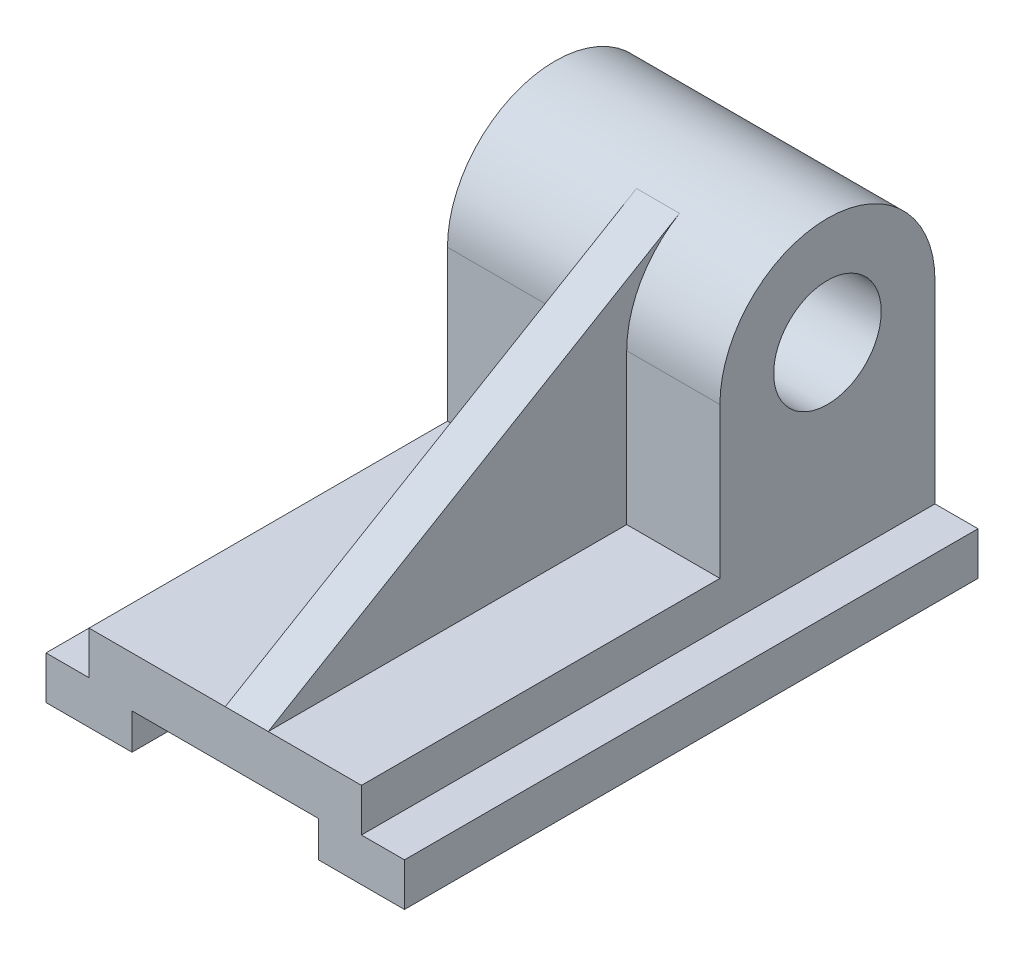
ISO-10303-21;
HEADER;
FILE_DESCRIPTION(('STEP AP214'),'2;1');
FILE_NAME('part.step','',(''),(''),'','','');
FILE_SCHEMA(('AUTOMOTIVE_DESIGN { 1 0 10303 214 1 1 1 1 }'));
ENDSEC;
DATA;
#1=APPLICATION_CONTEXT('core data for automotive mechanical design processes');
#2=APPLICATION_PROTOCOL_DEFINITION('international standard','automotive_design',2000,#1);
#3=PRODUCT_CONTEXT('',#1,'mechanical');
#4=PRODUCT('Part','Part','',(#3));
#5=PRODUCT_RELATED_PRODUCT_CATEGORY('part','',(#4));
#6=PRODUCT_DEFINITION_FORMATION('','',#4);
#7=PRODUCT_DEFINITION_CONTEXT('part definition',#1,'design');
#8=PRODUCT_DEFINITION('design','',#6,#7);
#9=PRODUCT_DEFINITION_SHAPE('','',#8);
#10=(LENGTH_UNIT() NAMED_UNIT(*) SI_UNIT(.MILLI.,.METRE.));
#11=(NAMED_UNIT(*) PLANE_ANGLE_UNIT() SI_UNIT($,.RADIAN.));
#12=(NAMED_UNIT(*) SI_UNIT($,.STERADIAN.) SOLID_ANGLE_UNIT());
#13=UNCERTAINTY_MEASURE_WITH_UNIT(LENGTH_MEASURE(1.E-05),#10,'distance_accuracy_value','');
#14=(GEOMETRIC_REPRESENTATION_CONTEXT(3) GLOBAL_UNCERTAINTY_ASSIGNED_CONTEXT((#13)) GLOBAL_UNIT_ASSIGNED_CONTEXT((#10,
#11,#12)) REPRESENTATION_CONTEXT('',''));
#15=CARTESIAN_POINT('',(0.,0.,0.));
#16=DIRECTION('',(0.,0.,1.));
#17=DIRECTION('',(1.,0.,0.));
#18=AXIS2_PLACEMENT_3D('',#15,#16,#17);
#19=CARTESIAN_POINT('',(12.,24.,-160.));
#20=DIRECTION('',(0.,1.,0.));
#21=DIRECTION('',(-1.,0.,0.));
#22=AXIS2_PLACEMENT_3D('',#19,#20,#21);
#23=PLANE('',#22);
#24=DIRECTION('',(-1.,0.,0.));
#25=VECTOR('',#24,1.);
#26=CARTESIAN_POINT('',(12.,24.,0.));
#27=LINE('',#26,#25);
#28=CARTESIAN_POINT('',(50.,24.,0.));
#29=VERTEX_POINT('',#28);
#30=CARTESIAN_POINT('',(12.,24.,0.));
#31=VERTEX_POINT('',#30);
#32=EDGE_CURVE('E173',#29,#31,#27,.T.);
#33=ORIENTED_EDGE('',*,*,#32,.F.);
#34=DIRECTION('',(0.,0.,-1.));
#35=VECTOR('',#34,1.);
#36=CARTESIAN_POINT('',(50.,24.,-160.));
#37=LINE('',#36,#35);
#38=CARTESIAN_POINT('',(50.,24.,-100.));
#39=VERTEX_POINT('',#38);
#40=EDGE_CURVE('E157',#29,#39,#37,.T.);
#41=ORIENTED_EDGE('',*,*,#40,.T.);
#42=DIRECTION('',(1.,0.,0.));
#43=VECTOR('',#42,1.);
#44=CARTESIAN_POINT('',(12.,24.,-100.));
#45=LINE('',#44,#43);
#46=CARTESIAN_POINT('',(12.,24.,-100.));
#47=VERTEX_POINT('',#46);
#48=EDGE_CURVE('E56',#47,#39,#45,.T.);
#49=ORIENTED_EDGE('',*,*,#48,.F.);
#50=DIRECTION('',(0.,0.,1.));
#51=VECTOR('',#50,1.);
#52=CARTESIAN_POINT('',(12.,24.,-160.));
#53=LINE('',#52,#51);
#54=EDGE_CURVE('E174',#47,#31,#53,.T.);
#55=ORIENTED_EDGE('',*,*,#54,.T.);
#56=EDGE_LOOP('',(#33,#41,#49,#55));
#57=FACE_BOUND('',#56,.T.);
#58=ADVANCED_FACE('F33',(#57),#23,.T.);
#59=CARTESIAN_POINT('',(12.,24.,-100.));
#60=DIRECTION('',(0.,0.,1.));
#61=DIRECTION('',(0.,-1.,0.));
#62=AXIS2_PLACEMENT_3D('',#59,#60,#61);
#63=PLANE('',#62);
#64=ORIENTED_EDGE('',*,*,#48,.T.);
#65=DIRECTION('',(0.,1.,0.));
#66=VECTOR('',#65,1.);
#67=CARTESIAN_POINT('',(50.,24.,-100.));
#68=LINE('',#67,#66);
#69=CARTESIAN_POINT('',(50.,66.,-100.));
#70=VERTEX_POINT('',#69);
#71=EDGE_CURVE('E160',#39,#70,#68,.T.);
#72=ORIENTED_EDGE('',*,*,#71,.T.);
#73=DIRECTION('',(1.,0.,0.));
#74=VECTOR('',#73,1.);
#75=CARTESIAN_POINT('',(12.,66.,-100.));
#76=LINE('',#75,#74);
#77=CARTESIAN_POINT('',(12.,66.,-100.));
#78=VERTEX_POINT('',#77);
#79=EDGE_CURVE('E213',#78,#70,#76,.T.);
#80=ORIENTED_EDGE('',*,*,#79,.F.);
#81=DIRECTION('',(0.,-1.,0.));
#82=VECTOR('',#81,1.);
#83=CARTESIAN_POINT('',(12.,24.,-100.));
#84=LINE('',#83,#82);
#85=EDGE_CURVE('E201',#78,#47,#84,.T.);
#86=ORIENTED_EDGE('',*,*,#85,.T.);
#87=EDGE_LOOP('',(#64,#72,#80,#86));
#88=FACE_BOUND('',#87,.T.);
#89=ADVANCED_FACE('F362',(#88),#63,.T.);
#90=CARTESIAN_POINT('',(24.,0.,-160.));
#91=DIRECTION('',(0.,-1.,0.));
#92=DIRECTION('',(1.,0.,0.));
#93=AXIS2_PLACEMENT_3D('',#90,#91,#92);
#94=PLANE('',#93);
#95=DIRECTION('',(1.,0.,0.));
#96=VECTOR('',#95,1.);
#97=CARTESIAN_POINT('',(24.,0.,0.));
#98=LINE('',#97,#96);
#99=CARTESIAN_POINT('',(0.,0.,0.));
#100=VERTEX_POINT('',#99);
#101=CARTESIAN_POINT('',(24.,0.,0.));
#102=VERTEX_POINT('',#101);
#103=EDGE_CURVE('E211',#100,#102,#98,.T.);
#104=ORIENTED_EDGE('',*,*,#103,.F.);
#105=DIRECTION('',(0.,0.,1.));
#106=VECTOR('',#105,1.);
#107=CARTESIAN_POINT('',(0.,0.,-160.));
#108=LINE('',#107,#106);
#109=CARTESIAN_POINT('',(0.,0.,-160.));
#110=VERTEX_POINT('',#109);
#111=EDGE_CURVE('E41',#110,#100,#108,.T.);
#112=ORIENTED_EDGE('',*,*,#111,.F.);
#113=DIRECTION('',(1.,0.,0.));
#114=VECTOR('',#113,1.);
#115=CARTESIAN_POINT('',(24.,0.,-160.));
#116=LINE('',#115,#114);
#117=CARTESIAN_POINT('',(24.,0.,-160.));
#118=VERTEX_POINT('',#117);
#119=EDGE_CURVE('E218',#110,#118,#116,.T.);
#120=ORIENTED_EDGE('',*,*,#119,.T.);
#121=DIRECTION('',(0.,0.,1.));
#122=VECTOR('',#121,1.);
#123=CARTESIAN_POINT('',(24.,0.,-160.));
#124=LINE('',#123,#122);
#125=EDGE_CURVE('E251',#118,#102,#124,.T.);
#126=ORIENTED_EDGE('',*,*,#125,.T.);
#127=EDGE_LOOP('',(#104,#112,#120,#126));
#128=FACE_BOUND('',#127,.T.);
#129=ADVANCED_FACE('F35',(#128),#94,.T.);
#130=CARTESIAN_POINT('',(0.,0.,-160.));
#131=DIRECTION('',(-1.,0.,0.));
#132=DIRECTION('',(0.,0.,1.));
#133=AXIS2_PLACEMENT_3D('',#130,#131,#132);
#134=PLANE('',#133);
#135=DIRECTION('',(0.,-1.,0.));
#136=VECTOR('',#135,1.);
#137=CARTESIAN_POINT('',(0.,0.,0.));
#138=LINE('',#137,#136);
#139=CARTESIAN_POINT('',(0.,12.,0.));
#140=VERTEX_POINT('',#139);
#141=EDGE_CURVE('E222',#140,#100,#138,.T.);
#142=ORIENTED_EDGE('',*,*,#141,.F.);
#143=DIRECTION('',(0.,0.,1.));
#144=VECTOR('',#143,1.);
#145=CARTESIAN_POINT('',(0.,12.,-160.));
#146=LINE('',#145,#144);
#147=CARTESIAN_POINT('',(0.,12.,-160.));
#148=VERTEX_POINT('',#147);
#149=EDGE_CURVE('E280',#148,#140,#146,.T.);
#150=ORIENTED_EDGE('',*,*,#149,.F.);
#151=DIRECTION('',(0.,-1.,0.));
#152=VECTOR('',#151,1.);
#153=CARTESIAN_POINT('',(0.,0.,-160.));
#154=LINE('',#153,#152);
#155=EDGE_CURVE('E248',#148,#110,#154,.T.);
#156=ORIENTED_EDGE('',*,*,#155,.T.);
#157=ORIENTED_EDGE('',*,*,#111,.T.);
#158=EDGE_LOOP('',(#142,#150,#156,#157));
#159=FACE_BOUND('',#158,.T.);
#160=ADVANCED_FACE('F310',(#159),#134,.T.);
#161=CARTESIAN_POINT('',(0.,12.,-160.));
#162=DIRECTION('',(0.,1.,0.));
#163=DIRECTION('',(0.,0.,1.));
#164=AXIS2_PLACEMENT_3D('',#161,#162,#163);
#165=PLANE('',#164);
#166=DIRECTION('',(-1.,0.,0.));
#167=VECTOR('',#166,1.);
#168=CARTESIAN_POINT('',(0.,12.,0.));
#169=LINE('',#168,#167);
#170=CARTESIAN_POINT('',(12.,12.,0.));
#171=VERTEX_POINT('',#170);
#172=EDGE_CURVE('E274',#171,#140,#169,.T.);
#173=ORIENTED_EDGE('',*,*,#172,.F.);
#174=DIRECTION('',(0.,0.,1.));
#175=VECTOR('',#174,1.);
#176=CARTESIAN_POINT('',(12.,12.,-160.));
#177=LINE('',#176,#175);
#178=CARTESIAN_POINT('',(12.,12.,-160.));
#179=VERTEX_POINT('',#178);
#180=EDGE_CURVE('E282',#179,#171,#177,.T.);
#181=ORIENTED_EDGE('',*,*,#180,.F.);
#182=DIRECTION('',(-1.,0.,0.));
#183=VECTOR('',#182,1.);
#184=CARTESIAN_POINT('',(0.,12.,-160.));
#185=LINE('',#184,#183);
#186=EDGE_CURVE('E245',#179,#148,#185,.T.);
#187=ORIENTED_EDGE('',*,*,#186,.T.);
#188=ORIENTED_EDGE('',*,*,#149,.T.);
#189=EDGE_LOOP('',(#173,#181,#187,#188));
#190=FACE_BOUND('',#189,.T.);
#191=ADVANCED_FACE('F369',(#190),#165,.T.);
#192=CARTESIAN_POINT('',(12.,12.,-160.));
#193=DIRECTION('',(-1.,0.,0.));
#194=DIRECTION('',(0.,0.,1.));
#195=AXIS2_PLACEMENT_3D('',#192,#193,#194);
#196=PLANE('',#195);
#197=DIRECTION('',(0.,-1.,0.));
#198=VECTOR('',#197,1.);
#199=CARTESIAN_POINT('',(12.,12.,0.));
#200=LINE('',#199,#198);
#201=EDGE_CURVE('E272',#31,#171,#200,.T.);
#202=ORIENTED_EDGE('',*,*,#201,.F.);
#203=ORIENTED_EDGE('',*,*,#54,.F.);
#204=ORIENTED_EDGE('',*,*,#85,.F.);
#205=CARTESIAN_POINT('',(12.,66.,-130.));
#206=DIRECTION('',(1.,0.,0.));
#207=DIRECTION('',(0.,0.,1.));
#208=AXIS2_PLACEMENT_3D('',#205,#206,#207);
#209=CIRCLE('',#208,30.);
#210=CARTESIAN_POINT('',(12.,66.,-160.));
#211=VERTEX_POINT('',#210);
#212=EDGE_CURVE('E198',#211,#78,#209,.T.);
#213=ORIENTED_EDGE('',*,*,#212,.F.);
#214=DIRECTION('',(0.,-1.,0.));
#215=VECTOR('',#214,1.);
#216=CARTESIAN_POINT('',(12.,12.,-160.));
#217=LINE('',#216,#215);
#218=EDGE_CURVE('E242',#211,#179,#217,.T.);
#219=ORIENTED_EDGE('',*,*,#218,.T.);
#220=ORIENTED_EDGE('',*,*,#180,.T.);
#221=EDGE_LOOP('',(#202,#203,#204,#213,#219,#220));
#222=FACE_BOUND('',#221,.T.);
#223=CARTESIAN_POINT('',(12.,66.,-130.));
#224=DIRECTION('',(1.,0.,0.));
#225=DIRECTION('',(0.,0.,-1.));
#226=AXIS2_PLACEMENT_3D('',#223,#224,#225);
#227=CIRCLE('',#226,15.);
#228=CARTESIAN_POINT('',(12.,66.,-145.));
#229=VERTEX_POINT('',#228);
#230=EDGE_CURVE('E189',#229,#229,#227,.T.);
#231=ORIENTED_EDGE('',*,*,#230,.T.);
#232=EDGE_LOOP('',(#231));
#233=FACE_BOUND('',#232,.T.);
#234=ADVANCED_FACE('F366',(#222,#233),#196,.T.);
#235=DIRECTION('',(0.,0.,-1.));
#236=VECTOR('',#235,1.);
#237=CARTESIAN_POINT('',(62.,24.,-160.));
#238=LINE('',#237,#236);
#239=CARTESIAN_POINT('',(62.,24.,0.));
#240=VERTEX_POINT('',#239);
#241=CARTESIAN_POINT('',(62.,24.,-100.));
#242=VERTEX_POINT('',#241);
#243=EDGE_CURVE('E186',#240,#242,#238,.T.);
#244=ORIENTED_EDGE('',*,*,#243,.F.);
#245=CARTESIAN_POINT('',(88.,24.,0.));
#246=VERTEX_POINT('',#245);
#247=EDGE_CURVE('E178',#246,#240,#27,.T.);
#248=ORIENTED_EDGE('',*,*,#247,.F.);
#249=DIRECTION('',(0.,0.,1.));
#250=VECTOR('',#249,1.);
#251=CARTESIAN_POINT('',(88.,24.,-160.));
#252=LINE('',#251,#250);
#253=CARTESIAN_POINT('',(88.,24.,-100.));
#254=VERTEX_POINT('',#253);
#255=EDGE_CURVE('E285',#254,#246,#252,.T.);
#256=ORIENTED_EDGE('',*,*,#255,.F.);
#257=EDGE_CURVE('E212',#242,#254,#45,.T.);
#258=ORIENTED_EDGE('',*,*,#257,.F.);
#259=EDGE_LOOP('',(#244,#248,#256,#258));
#260=FACE_BOUND('',#259,.T.);
#261=ADVANCED_FACE('F345',(#260),#23,.T.);
#262=CARTESIAN_POINT('',(88.,24.,-160.));
#263=DIRECTION('',(1.,0.,0.));
#264=DIRECTION('',(0.,0.,-1.));
#265=AXIS2_PLACEMENT_3D('',#262,#263,#264);
#266=PLANE('',#265);
#267=DIRECTION('',(0.,1.,0.));
#268=VECTOR('',#267,1.);
#269=CARTESIAN_POINT('',(88.,24.,0.));
#270=LINE('',#269,#268);
#271=CARTESIAN_POINT('',(88.,12.,0.));
#272=VERTEX_POINT('',#271);
#273=EDGE_CURVE('E179',#272,#246,#270,.T.);
#274=ORIENTED_EDGE('',*,*,#273,.F.);
#275=DIRECTION('',(0.,0.,1.));
#276=VECTOR('',#275,1.);
#277=CARTESIAN_POINT('',(88.,12.,-160.));
#278=LINE('',#277,#276);
#279=CARTESIAN_POINT('',(88.,12.,-160.));
#280=VERTEX_POINT('',#279);
#281=EDGE_CURVE('E287',#280,#272,#278,.T.);
#282=ORIENTED_EDGE('',*,*,#281,.F.);
#283=DIRECTION('',(0.,1.,0.));
#284=VECTOR('',#283,1.);
#285=CARTESIAN_POINT('',(88.,24.,-160.));
#286=LINE('',#285,#284);
#287=CARTESIAN_POINT('',(88.,66.,-160.));
#288=VERTEX_POINT('',#287);
#289=EDGE_CURVE('E239',#280,#288,#286,.T.);
#290=ORIENTED_EDGE('',*,*,#289,.T.);
#291=CARTESIAN_POINT('',(88.,66.,-130.));
#292=DIRECTION('',(1.,0.,0.));
#293=DIRECTION('',(0.,0.,1.));
#294=AXIS2_PLACEMENT_3D('',#291,#292,#293);
#295=CIRCLE('',#294,30.);
#296=CARTESIAN_POINT('',(88.,66.,-100.));
#297=VERTEX_POINT('',#296);
#298=EDGE_CURVE('E196',#288,#297,#295,.T.);
#299=ORIENTED_EDGE('',*,*,#298,.T.);
#300=DIRECTION('',(0.,-1.,0.));
#301=VECTOR('',#300,1.);
#302=CARTESIAN_POINT('',(88.,24.,-100.));
#303=LINE('',#302,#301);
#304=EDGE_CURVE('E202',#297,#254,#303,.T.);
#305=ORIENTED_EDGE('',*,*,#304,.T.);
#306=ORIENTED_EDGE('',*,*,#255,.T.);
#307=EDGE_LOOP('',(#274,#282,#290,#299,#305,#306));
#308=FACE_BOUND('',#307,.T.);
#309=CARTESIAN_POINT('',(88.,66.,-130.));
#310=DIRECTION('',(1.,0.,0.));
#311=DIRECTION('',(0.,0.,-1.));
#312=AXIS2_PLACEMENT_3D('',#309,#310,#311);
#313=CIRCLE('',#312,15.);
#314=CARTESIAN_POINT('',(88.,66.,-145.));
#315=VERTEX_POINT('',#314);
#316=EDGE_CURVE('E185',#315,#315,#313,.T.);
#317=ORIENTED_EDGE('',*,*,#316,.F.);
#318=EDGE_LOOP('',(#317));
#319=FACE_BOUND('',#318,.T.);
#320=ADVANCED_FACE('F337',(#308,#319),#266,.T.);
#321=CARTESIAN_POINT('',(88.,12.,-160.));
#322=DIRECTION('',(0.,1.,0.));
#323=DIRECTION('',(0.,0.,1.));
#324=AXIS2_PLACEMENT_3D('',#321,#322,#323);
#325=PLANE('',#324);
#326=DIRECTION('',(-1.,0.,0.));
#327=VECTOR('',#326,1.);
#328=CARTESIAN_POINT('',(88.,12.,0.));
#329=LINE('',#328,#327);
#330=CARTESIAN_POINT('',(100.,12.,0.));
#331=VERTEX_POINT('',#330);
#332=EDGE_CURVE('E268',#331,#272,#329,.T.);
#333=ORIENTED_EDGE('',*,*,#332,.F.);
#334=DIRECTION('',(0.,0.,1.));
#335=VECTOR('',#334,1.);
#336=CARTESIAN_POINT('',(100.,12.,-160.));
#337=LINE('',#336,#335);
#338=CARTESIAN_POINT('',(100.,12.,-160.));
#339=VERTEX_POINT('',#338);
#340=EDGE_CURVE('E289',#339,#331,#337,.T.);
#341=ORIENTED_EDGE('',*,*,#340,.F.);
#342=DIRECTION('',(-1.,0.,0.));
#343=VECTOR('',#342,1.);
#344=CARTESIAN_POINT('',(88.,12.,-160.));
#345=LINE('',#344,#343);
#346=EDGE_CURVE('E236',#339,#280,#345,.T.);
#347=ORIENTED_EDGE('',*,*,#346,.T.);
#348=ORIENTED_EDGE('',*,*,#281,.T.);
#349=EDGE_LOOP('',(#333,#341,#347,#348));
#350=FACE_BOUND('',#349,.T.);
#351=ADVANCED_FACE('F334',(#350),#325,.T.);
#352=CARTESIAN_POINT('',(100.,12.,-160.));
#353=DIRECTION('',(1.,0.,0.));
#354=DIRECTION('',(0.,0.,-1.));
#355=AXIS2_PLACEMENT_3D('',#352,#353,#354);
#356=PLANE('',#355);
#357=DIRECTION('',(0.,1.,0.));
#358=VECTOR('',#357,1.);
#359=CARTESIAN_POINT('',(100.,12.,0.));
#360=LINE('',#359,#358);
#361=CARTESIAN_POINT('',(100.,0.,0.));
#362=VERTEX_POINT('',#361);
#363=EDGE_CURVE('E265',#362,#331,#360,.T.);
#364=ORIENTED_EDGE('',*,*,#363,.F.);
#365=DIRECTION('',(0.,0.,1.));
#366=VECTOR('',#365,1.);
#367=CARTESIAN_POINT('',(100.,0.,-160.));
#368=LINE('',#367,#366);
#369=CARTESIAN_POINT('',(100.,0.,-160.));
#370=VERTEX_POINT('',#369);
#371=EDGE_CURVE('E291',#370,#362,#368,.T.);
#372=ORIENTED_EDGE('',*,*,#371,.F.);
#373=DIRECTION('',(0.,1.,0.));
#374=VECTOR('',#373,1.);
#375=CARTESIAN_POINT('',(100.,12.,-160.));
#376=LINE('',#375,#374);
#377=EDGE_CURVE('E233',#370,#339,#376,.T.);
#378=ORIENTED_EDGE('',*,*,#377,.T.);
#379=ORIENTED_EDGE('',*,*,#340,.T.);
#380=EDGE_LOOP('',(#364,#372,#378,#379));
#381=FACE_BOUND('',#380,.T.);
#382=ADVANCED_FACE('F330',(#381),#356,.T.);
#383=CARTESIAN_POINT('',(100.,0.,-160.));
#384=DIRECTION('',(0.,-1.,0.));
#385=DIRECTION('',(1.,0.,0.));
#386=AXIS2_PLACEMENT_3D('',#383,#384,#385);
#387=PLANE('',#386);
#388=DIRECTION('',(1.,0.,0.));
#389=VECTOR('',#388,1.);
#390=CARTESIAN_POINT('',(100.,0.,0.));
#391=LINE('',#390,#389);
#392=CARTESIAN_POINT('',(76.,0.,0.));
#393=VERTEX_POINT('',#392);
#394=EDGE_CURVE('E262',#393,#362,#391,.T.);
#395=ORIENTED_EDGE('',*,*,#394,.F.);
#396=DIRECTION('',(0.,0.,1.));
#397=VECTOR('',#396,1.);
#398=CARTESIAN_POINT('',(76.,0.,-160.));
#399=LINE('',#398,#397);
#400=CARTESIAN_POINT('',(76.,0.,-160.));
#401=VERTEX_POINT('',#400);
#402=EDGE_CURVE('E293',#401,#393,#399,.T.);
#403=ORIENTED_EDGE('',*,*,#402,.F.);
#404=DIRECTION('',(1.,0.,0.));
#405=VECTOR('',#404,1.);
#406=CARTESIAN_POINT('',(100.,0.,-160.));
#407=LINE('',#406,#405);
#408=EDGE_CURVE('E230',#401,#370,#407,.T.);
#409=ORIENTED_EDGE('',*,*,#408,.T.);
#410=ORIENTED_EDGE('',*,*,#371,.T.);
#411=EDGE_LOOP('',(#395,#403,#409,#410));
#412=FACE_BOUND('',#411,.T.);
#413=ADVANCED_FACE('F327',(#412),#387,.T.);
#414=CARTESIAN_POINT('',(76.,0.,-160.));
#415=DIRECTION('',(-1.,0.,0.));
#416=DIRECTION('',(0.,0.,1.));
#417=AXIS2_PLACEMENT_3D('',#414,#415,#416);
#418=PLANE('',#417);
#419=DIRECTION('',(0.,-1.,0.));
#420=VECTOR('',#419,1.);
#421=CARTESIAN_POINT('',(76.,0.,0.));
#422=LINE('',#421,#420);
#423=CARTESIAN_POINT('',(76.,9.99999999999999,0.));
#424=VERTEX_POINT('',#423);
#425=EDGE_CURVE('E259',#424,#393,#422,.T.);
#426=ORIENTED_EDGE('',*,*,#425,.F.);
#427=DIRECTION('',(0.,0.,1.));
#428=VECTOR('',#427,1.);
#429=CARTESIAN_POINT('',(76.,9.99999999999999,-160.));
#430=LINE('',#429,#428);
#431=CARTESIAN_POINT('',(76.,9.99999999999999,-160.));
#432=VERTEX_POINT('',#431);
#433=EDGE_CURVE('E295',#432,#424,#430,.T.);
#434=ORIENTED_EDGE('',*,*,#433,.F.);
#435=DIRECTION('',(0.,-1.,0.));
#436=VECTOR('',#435,1.);
#437=CARTESIAN_POINT('',(76.,0.,-160.));
#438=LINE('',#437,#436);
#439=EDGE_CURVE('E227',#432,#401,#438,.T.);
#440=ORIENTED_EDGE('',*,*,#439,.T.);
#441=ORIENTED_EDGE('',*,*,#402,.T.);
#442=EDGE_LOOP('',(#426,#434,#440,#441));
#443=FACE_BOUND('',#442,.T.);
#444=ADVANCED_FACE('F323',(#443),#418,.T.);
#445=CARTESIAN_POINT('',(24.,9.99999999999999,-160.));
#446=DIRECTION('',(0.,-1.,0.));
#447=DIRECTION('',(0.,0.,-1.));
#448=AXIS2_PLACEMENT_3D('',#445,#446,#447);
#449=PLANE('',#448);
#450=ORIENTED_EDGE('',*,*,#433,.T.);
#451=DIRECTION('',(1.,0.,0.));
#452=VECTOR('',#451,1.);
#453=CARTESIAN_POINT('',(24.,9.99999999999999,0.));
#454=LINE('',#453,#452);
#455=CARTESIAN_POINT('',(24.,9.99999999999999,0.));
#456=VERTEX_POINT('',#455);
#457=EDGE_CURVE('E257',#456,#424,#454,.T.);
#458=ORIENTED_EDGE('',*,*,#457,.F.);
#459=DIRECTION('',(0.,0.,1.));
#460=VECTOR('',#459,1.);
#461=CARTESIAN_POINT('',(24.,9.99999999999999,-160.));
#462=LINE('',#461,#460);
#463=CARTESIAN_POINT('',(24.,9.99999999999999,-160.));
#464=VERTEX_POINT('',#463);
#465=EDGE_CURVE('E298',#464,#456,#462,.T.);
#466=ORIENTED_EDGE('',*,*,#465,.F.);
#467=DIRECTION('',(1.,0.,0.));
#468=VECTOR('',#467,1.);
#469=CARTESIAN_POINT('',(24.,9.99999999999999,-160.));
#470=LINE('',#469,#468);
#471=EDGE_CURVE('E225',#464,#432,#470,.T.);
#472=ORIENTED_EDGE('',*,*,#471,.T.);
#473=EDGE_LOOP('',(#450,#458,#466,#472));
#474=FACE_BOUND('',#473,.T.);
#475=ADVANCED_FACE('F320',(#474),#449,.T.);
#476=CARTESIAN_POINT('',(24.,0.,-160.));
#477=DIRECTION('',(1.,0.,0.));
#478=DIRECTION('',(0.,0.,-1.));
#479=AXIS2_PLACEMENT_3D('',#476,#477,#478);
#480=PLANE('',#479);
#481=DIRECTION('',(0.,1.,0.));
#482=VECTOR('',#481,1.);
#483=CARTESIAN_POINT('',(24.,0.,0.));
#484=LINE('',#483,#482);
#485=EDGE_CURVE('E254',#102,#456,#484,.T.);
#486=ORIENTED_EDGE('',*,*,#485,.F.);
#487=ORIENTED_EDGE('',*,*,#125,.F.);
#488=DIRECTION('',(0.,1.,0.));
#489=VECTOR('',#488,1.);
#490=CARTESIAN_POINT('',(24.,0.,-160.));
#491=LINE('',#490,#489);
#492=EDGE_CURVE('E221',#118,#464,#491,.T.);
#493=ORIENTED_EDGE('',*,*,#492,.T.);
#494=ORIENTED_EDGE('',*,*,#465,.T.);
#495=EDGE_LOOP('',(#486,#487,#493,#494));
#496=FACE_BOUND('',#495,.T.);
#497=ADVANCED_FACE('F305',(#496),#480,.T.);
#498=CARTESIAN_POINT('',(0.,0.,-160.));
#499=DIRECTION('',(0.,0.,-1.));
#500=DIRECTION('',(-1.,0.,0.));
#501=AXIS2_PLACEMENT_3D('',#498,#499,#500);
#502=PLANE('',#501);
#503=ORIENTED_EDGE('',*,*,#439,.F.);
#504=ORIENTED_EDGE('',*,*,#471,.F.);
#505=ORIENTED_EDGE('',*,*,#492,.F.);
#506=ORIENTED_EDGE('',*,*,#119,.F.);
#507=ORIENTED_EDGE('',*,*,#155,.F.);
#508=ORIENTED_EDGE('',*,*,#186,.F.);
#509=ORIENTED_EDGE('',*,*,#218,.F.);
#510=DIRECTION('',(1.,0.,0.));
#511=VECTOR('',#510,1.);
#512=CARTESIAN_POINT('',(12.,66.,-160.));
#513=LINE('',#512,#511);
#514=EDGE_CURVE('E205',#211,#288,#513,.T.);
#515=ORIENTED_EDGE('',*,*,#514,.T.);
#516=ORIENTED_EDGE('',*,*,#289,.F.);
#517=ORIENTED_EDGE('',*,*,#346,.F.);
#518=ORIENTED_EDGE('',*,*,#377,.F.);
#519=ORIENTED_EDGE('',*,*,#408,.F.);
#520=EDGE_LOOP('',(#503,#504,#505,#506,#507,#508,#509,#515,#516,#517,#518,#519));
#521=FACE_BOUND('',#520,.T.);
#522=ADVANCED_FACE('F314',(#521),#502,.T.);
#523=CARTESIAN_POINT('',(0.,0.,0.));
#524=DIRECTION('',(0.,0.,-1.));
#525=DIRECTION('',(-1.,0.,0.));
#526=AXIS2_PLACEMENT_3D('',#523,#524,#525);
#527=PLANE('',#526);
#528=ORIENTED_EDGE('',*,*,#247,.T.);
#529=DIRECTION('',(-1.,0.,0.));
#530=VECTOR('',#529,1.);
#531=CARTESIAN_POINT('',(0.,24.,0.));
#532=LINE('',#531,#530);
#533=EDGE_CURVE('E168',#29,#240,#532,.F.);
#534=ORIENTED_EDGE('',*,*,#533,.F.);
#535=ORIENTED_EDGE('',*,*,#32,.T.);
#536=ORIENTED_EDGE('',*,*,#201,.T.);
#537=ORIENTED_EDGE('',*,*,#172,.T.);
#538=ORIENTED_EDGE('',*,*,#141,.T.);
#539=ORIENTED_EDGE('',*,*,#103,.T.);
#540=ORIENTED_EDGE('',*,*,#485,.T.);
#541=ORIENTED_EDGE('',*,*,#457,.T.);
#542=ORIENTED_EDGE('',*,*,#425,.T.);
#543=ORIENTED_EDGE('',*,*,#394,.T.);
#544=ORIENTED_EDGE('',*,*,#363,.T.);
#545=ORIENTED_EDGE('',*,*,#332,.T.);
#546=ORIENTED_EDGE('',*,*,#273,.T.);
#547=EDGE_LOOP('',(#528,#534,#535,#536,#537,#538,#539,#540,#541,#542,#543,#544,#545,#546));
#548=FACE_BOUND('',#547,.T.);
#549=ADVANCED_FACE('F182',(#548),#527,.F.);
#550=DIRECTION('',(0.,1.,0.));
#551=VECTOR('',#550,1.);
#552=CARTESIAN_POINT('',(62.,24.,-100.));
#553=LINE('',#552,#551);
#554=CARTESIAN_POINT('',(62.,66.,-100.));
#555=VERTEX_POINT('',#554);
#556=EDGE_CURVE('E191',#242,#555,#553,.T.);
#557=ORIENTED_EDGE('',*,*,#556,.F.);
#558=ORIENTED_EDGE('',*,*,#257,.T.);
#559=ORIENTED_EDGE('',*,*,#304,.F.);
#560=EDGE_CURVE('E216',#555,#297,#76,.T.);
#561=ORIENTED_EDGE('',*,*,#560,.F.);
#562=EDGE_LOOP('',(#557,#558,#559,#561));
#563=FACE_BOUND('',#562,.T.);
#564=ADVANCED_FACE('F352',(#563),#63,.T.);
#565=CARTESIAN_POINT('',(12.,66.,-130.));
#566=DIRECTION('',(1.,0.,0.));
#567=DIRECTION('',(0.,0.,-1.));
#568=AXIS2_PLACEMENT_3D('',#565,#566,#567);
#569=CYLINDRICAL_SURFACE('',#568,30.);
#570=ORIENTED_EDGE('',*,*,#298,.F.);
#571=ORIENTED_EDGE('',*,*,#514,.F.);
#572=ORIENTED_EDGE('',*,*,#212,.T.);
#573=ORIENTED_EDGE('',*,*,#79,.T.);
#574=CARTESIAN_POINT('',(50.,66.,-130.));
#575=DIRECTION('',(1.,0.,0.));
#576=DIRECTION('',(0.,0.,-1.));
#577=AXIS2_PLACEMENT_3D('',#574,#575,#576);
#578=CIRCLE('',#577,30.);
#579=CARTESIAN_POINT('',(50.,91.8250354127861,-114.733450097408));
#580=VERTEX_POINT('',#579);
#581=EDGE_CURVE('E356',#70,#580,#578,.F.);
#582=ORIENTED_EDGE('',*,*,#581,.T.);
#583=DIRECTION('',(1.,0.,0.));
#584=VECTOR('',#583,1.);
#585=CARTESIAN_POINT('',(12.,91.8250354127861,-114.733450097408));
#586=LINE('',#585,#584);
#587=CARTESIAN_POINT('',(62.,91.8250354127861,-114.733450097408));
#588=VERTEX_POINT('',#587);
#589=EDGE_CURVE('E11',#580,#588,#586,.T.);
#590=ORIENTED_EDGE('',*,*,#589,.T.);
#591=CARTESIAN_POINT('',(62.,66.,-130.));
#592=DIRECTION('',(1.,0.,0.));
#593=DIRECTION('',(0.,0.,-1.));
#594=AXIS2_PLACEMENT_3D('',#591,#592,#593);
#595=CIRCLE('',#594,30.);
#596=EDGE_CURVE('E162',#555,#588,#595,.F.);
#597=ORIENTED_EDGE('',*,*,#596,.F.);
#598=ORIENTED_EDGE('',*,*,#560,.T.);
#599=EDGE_LOOP('',(#570,#571,#572,#573,#582,#590,#597,#598));
#600=FACE_BOUND('',#599,.T.);
#601=ADVANCED_FACE('F360',(#600),#569,.T.);
#602=CARTESIAN_POINT('',(12.,66.,-130.));
#603=DIRECTION('',(1.,0.,0.));
#604=DIRECTION('',(0.,0.,-1.));
#605=AXIS2_PLACEMENT_3D('',#602,#603,#604);
#606=CYLINDRICAL_SURFACE('',#605,15.);
#607=ORIENTED_EDGE('',*,*,#316,.T.);
#608=EDGE_LOOP('',(#607));
#609=FACE_BOUND('',#608,.T.);
#610=ORIENTED_EDGE('',*,*,#230,.F.);
#611=EDGE_LOOP('',(#610));
#612=FACE_BOUND('',#611,.T.);
#613=ADVANCED_FACE('F413',(#609,#612),#606,.F.);
#614=CARTESIAN_POINT('',(56.,24.,0.));
#615=DIRECTION('',(0.,-0.860834513759536,-0.508884996753081));
#616=DIRECTION('',(0.,0.508884996753081,-0.860834513759536));
#617=AXIS2_PLACEMENT_3D('',#614,#615,#616);
#618=PLANE('',#617);
#619=DIRECTION('',(0.,0.508884996753081,-0.860834513759536));
#620=VECTOR('',#619,1.);
#621=CARTESIAN_POINT('',(50.,24.,0.));
#622=LINE('',#621,#620);
#623=EDGE_CURVE('E48',#29,#580,#622,.T.);
#624=ORIENTED_EDGE('',*,*,#623,.F.);
#625=ORIENTED_EDGE('',*,*,#533,.T.);
#626=DIRECTION('',(0.,0.508884996753081,-0.860834513759536));
#627=VECTOR('',#626,1.);
#628=CARTESIAN_POINT('',(62.,24.,0.));
#629=LINE('',#628,#627);
#630=EDGE_CURVE('E171',#240,#588,#629,.T.);
#631=ORIENTED_EDGE('',*,*,#630,.T.);
#632=ORIENTED_EDGE('',*,*,#589,.F.);
#633=EDGE_LOOP('',(#624,#625,#631,#632));
#634=FACE_BOUND('',#633,.T.);
#635=ADVANCED_FACE('F165',(#634),#618,.F.);
#636=CARTESIAN_POINT('',(62.,48.,-80.));
#637=DIRECTION('',(1.,0.,0.));
#638=DIRECTION('',(0.,0.,-1.));
#639=AXIS2_PLACEMENT_3D('',#636,#637,#638);
#640=PLANE('',#639);
#641=ORIENTED_EDGE('',*,*,#630,.F.);
#642=ORIENTED_EDGE('',*,*,#243,.T.);
#643=ORIENTED_EDGE('',*,*,#556,.T.);
#644=ORIENTED_EDGE('',*,*,#596,.T.);
#645=EDGE_LOOP('',(#641,#642,#643,#644));
#646=FACE_BOUND('',#645,.T.);
#647=ADVANCED_FACE('F348',(#646),#640,.T.);
#648=CARTESIAN_POINT('',(50.,48.,-80.));
#649=DIRECTION('',(1.,0.,0.));
#650=DIRECTION('',(0.,0.,-1.));
#651=AXIS2_PLACEMENT_3D('',#648,#649,#650);
#652=PLANE('',#651);
#653=ORIENTED_EDGE('',*,*,#40,.F.);
#654=ORIENTED_EDGE('',*,*,#623,.T.);
#655=ORIENTED_EDGE('',*,*,#581,.F.);
#656=ORIENTED_EDGE('',*,*,#71,.F.);
#657=EDGE_LOOP('',(#653,#654,#655,#656));
#658=FACE_BOUND('',#657,.T.);
#659=ADVANCED_FACE('F158',(#658),#652,.F.);
#660=CLOSED_SHELL('',(#58,#89,#129,#160,#191,#234,#261,#320,#351,#382,#413,#444,#475,#497,#522,
#549,#564,#601,#613,#635,#647,#659));
#661=MANIFOLD_SOLID_BREP('B2',#660);
#662=ADVANCED_BREP_SHAPE_REPRESENTATION('',(#18,#661),#14);
#663=SHAPE_DEFINITION_REPRESENTATION(#9,#662);
ENDSEC;
END-ISO-10303-21;
